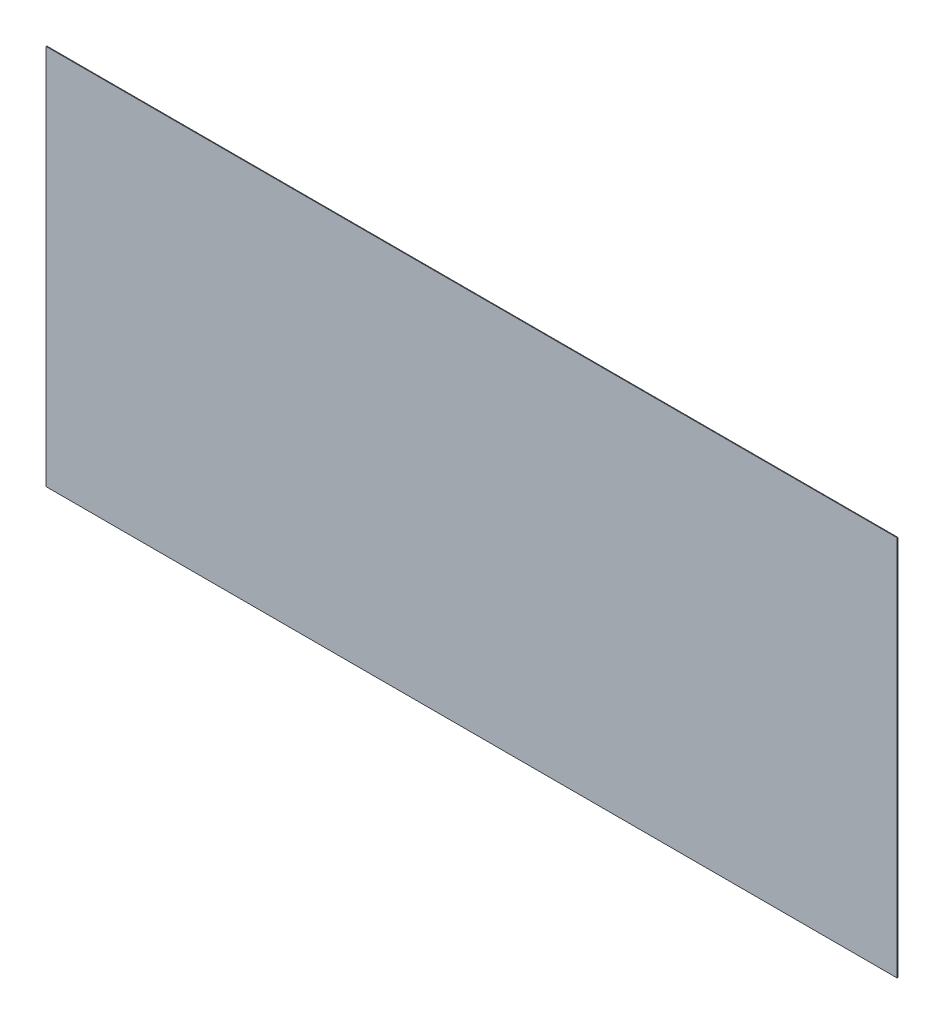
ISO-10303-21;
HEADER;
FILE_DESCRIPTION(('STEP AP214'),'2;1');
FILE_NAME('part.step','',(''),(''),'','','');
FILE_SCHEMA(('AUTOMOTIVE_DESIGN { 1 0 10303 214 1 1 1 1 }'));
ENDSEC;
DATA;
#1=APPLICATION_CONTEXT('core data for automotive mechanical design processes');
#2=APPLICATION_PROTOCOL_DEFINITION('international standard','automotive_design',2000,#1);
#3=PRODUCT_CONTEXT('',#1,'mechanical');
#4=PRODUCT('Part','Part','',(#3));
#5=PRODUCT_RELATED_PRODUCT_CATEGORY('part','',(#4));
#6=PRODUCT_DEFINITION_FORMATION('','',#4);
#7=PRODUCT_DEFINITION_CONTEXT('part definition',#1,'design');
#8=PRODUCT_DEFINITION('design','',#6,#7);
#9=PRODUCT_DEFINITION_SHAPE('','',#8);
#10=(LENGTH_UNIT() NAMED_UNIT(*) SI_UNIT(.MILLI.,.METRE.));
#11=(NAMED_UNIT(*) PLANE_ANGLE_UNIT() SI_UNIT($,.RADIAN.));
#12=(NAMED_UNIT(*) SI_UNIT($,.STERADIAN.) SOLID_ANGLE_UNIT());
#13=UNCERTAINTY_MEASURE_WITH_UNIT(LENGTH_MEASURE(1.E-05),#10,'distance_accuracy_value','');
#14=(GEOMETRIC_REPRESENTATION_CONTEXT(3) GLOBAL_UNCERTAINTY_ASSIGNED_CONTEXT((#13)) GLOBAL_UNIT_ASSIGNED_CONTEXT((#10,
#11,#12)) REPRESENTATION_CONTEXT('',''));
#15=CARTESIAN_POINT('',(0.,0.,0.));
#16=DIRECTION('',(0.,0.,1.));
#17=DIRECTION('',(1.,0.,0.));
#18=AXIS2_PLACEMENT_3D('',#15,#16,#17);
#19=CARTESIAN_POINT('',(-125.,-60.,150.4032));
#20=DIRECTION('',(1.,0.,0.));
#21=DIRECTION('',(0.,1.,0.));
#22=AXIS2_PLACEMENT_3D('',#19,#20,#21);
#23=PLANE('',#22);
#24=DIRECTION('',(0.,0.,1.));
#25=VECTOR('',#24,1.);
#26=CARTESIAN_POINT('',(-125.,19.,140.4032));
#27=LINE('',#26,#25);
#28=CARTESIAN_POINT('',(-125.,19.,150.327));
#29=VERTEX_POINT('',#28);
#30=CARTESIAN_POINT('',(-125.,19.,150.4032));
#31=VERTEX_POINT('',#30);
#32=EDGE_CURVE('E105',#29,#31,#27,.T.);
#33=ORIENTED_EDGE('',*,*,#32,.T.);
#34=DIRECTION('',(0.,-1.,0.));
#35=VECTOR('',#34,1.);
#36=CARTESIAN_POINT('',(-125.,-60.,150.4032));
#37=LINE('',#36,#35);
#38=CARTESIAN_POINT('',(-125.,60.,150.4032));
#39=VERTEX_POINT('',#38);
#40=EDGE_CURVE('E96',#39,#31,#37,.T.);
#41=ORIENTED_EDGE('',*,*,#40,.F.);
#42=DIRECTION('',(0.,0.,-1.));
#43=VECTOR('',#42,1.);
#44=CARTESIAN_POINT('',(-125.,60.,150.4032));
#45=LINE('',#44,#43);
#46=CARTESIAN_POINT('',(-125.,60.,150.327));
#47=VERTEX_POINT('',#46);
#48=EDGE_CURVE('E94',#39,#47,#45,.T.);
#49=ORIENTED_EDGE('',*,*,#48,.T.);
#50=DIRECTION('',(0.,-1.,0.));
#51=VECTOR('',#50,1.);
#52=CARTESIAN_POINT('',(-125.,-60.,150.327));
#53=LINE('',#52,#51);
#54=EDGE_CURVE('E102',#47,#29,#53,.T.);
#55=ORIENTED_EDGE('',*,*,#54,.T.);
#56=EDGE_LOOP('',(#33,#41,#49,#55));
#57=FACE_BOUND('',#56,.T.);
#58=ADVANCED_FACE('F41',(#57),#23,.F.);
#59=CARTESIAN_POINT('',(0.,0.,150.4032));
#60=DIRECTION('',(0.,0.,-1.));
#61=DIRECTION('',(-1.,0.,0.));
#62=AXIS2_PLACEMENT_3D('',#59,#60,#61);
#63=PLANE('',#62);
#64=DIRECTION('',(1.,0.,0.));
#65=VECTOR('',#64,1.);
#66=CARTESIAN_POINT('',(0.,19.,150.4032));
#67=LINE('',#66,#65);
#68=CARTESIAN_POINT('',(-33.5,19.,150.4032));
#69=VERTEX_POINT('',#68);
#70=EDGE_CURVE('E88',#31,#69,#67,.T.);
#71=ORIENTED_EDGE('',*,*,#70,.T.);
#72=DIRECTION('',(0.,-1.,0.));
#73=VECTOR('',#72,1.);
#74=CARTESIAN_POINT('',(-33.5,0.,150.4032));
#75=LINE('',#74,#73);
#76=CARTESIAN_POINT('',(-33.5,60.,150.4032));
#77=VERTEX_POINT('',#76);
#78=EDGE_CURVE('E83',#77,#69,#75,.T.);
#79=ORIENTED_EDGE('',*,*,#78,.F.);
#80=DIRECTION('',(-1.,0.,0.));
#81=VECTOR('',#80,1.);
#82=CARTESIAN_POINT('',(-125.,60.,150.4032));
#83=LINE('',#82,#81);
#84=EDGE_CURVE('E64',#77,#39,#83,.T.);
#85=ORIENTED_EDGE('',*,*,#84,.T.);
#86=ORIENTED_EDGE('',*,*,#40,.T.);
#87=EDGE_LOOP('',(#71,#79,#85,#86));
#88=FACE_BOUND('',#87,.T.);
#89=ADVANCED_FACE('F90',(#88),#63,.F.);
#90=CARTESIAN_POINT('',(0.,0.,150.327));
#91=DIRECTION('',(0.,0.,-1.));
#92=DIRECTION('',(-1.,0.,0.));
#93=AXIS2_PLACEMENT_3D('',#90,#91,#92);
#94=PLANE('',#93);
#95=DIRECTION('',(0.,1.,0.));
#96=VECTOR('',#95,1.);
#97=CARTESIAN_POINT('',(-33.5,0.,150.327));
#98=LINE('',#97,#96);
#99=CARTESIAN_POINT('',(-33.5,19.,150.327));
#100=VERTEX_POINT('',#99);
#101=CARTESIAN_POINT('',(-33.5,60.,150.327));
#102=VERTEX_POINT('',#101);
#103=EDGE_CURVE('E48',#100,#102,#98,.T.);
#104=ORIENTED_EDGE('',*,*,#103,.F.);
#105=DIRECTION('',(-1.,0.,0.));
#106=VECTOR('',#105,1.);
#107=CARTESIAN_POINT('',(0.,19.,150.327));
#108=LINE('',#107,#106);
#109=EDGE_CURVE('E11',#100,#29,#108,.T.);
#110=ORIENTED_EDGE('',*,*,#109,.T.);
#111=ORIENTED_EDGE('',*,*,#54,.F.);
#112=DIRECTION('',(-1.,0.,0.));
#113=VECTOR('',#112,1.);
#114=CARTESIAN_POINT('',(-125.,60.,150.327));
#115=LINE('',#114,#113);
#116=EDGE_CURVE('E99',#102,#47,#115,.T.);
#117=ORIENTED_EDGE('',*,*,#116,.F.);
#118=EDGE_LOOP('',(#104,#110,#111,#117));
#119=FACE_BOUND('',#118,.T.);
#120=ADVANCED_FACE('F110',(#119),#94,.T.);
#121=CARTESIAN_POINT('',(-125.,60.,150.4032));
#122=DIRECTION('',(0.,-1.,0.));
#123=DIRECTION('',(1.,0.,0.));
#124=AXIS2_PLACEMENT_3D('',#121,#122,#123);
#125=PLANE('',#124);
#126=ORIENTED_EDGE('',*,*,#84,.F.);
#127=DIRECTION('',(0.,0.,1.));
#128=VECTOR('',#127,1.);
#129=CARTESIAN_POINT('',(-33.5,60.,140.4032));
#130=LINE('',#129,#128);
#131=EDGE_CURVE('E81',#102,#77,#130,.T.);
#132=ORIENTED_EDGE('',*,*,#131,.F.);
#133=ORIENTED_EDGE('',*,*,#116,.T.);
#134=ORIENTED_EDGE('',*,*,#48,.F.);
#135=EDGE_LOOP('',(#126,#132,#133,#134));
#136=FACE_BOUND('',#135,.T.);
#137=ADVANCED_FACE('F92',(#136),#125,.F.);
#138=CARTESIAN_POINT('',(0.,19.,140.4032));
#139=DIRECTION('',(0.,-1.,0.));
#140=DIRECTION('',(0.,0.,-1.));
#141=AXIS2_PLACEMENT_3D('',#138,#139,#140);
#142=PLANE('',#141);
#143=DIRECTION('',(0.,0.,1.));
#144=VECTOR('',#143,1.);
#145=CARTESIAN_POINT('',(-33.5,19.,140.4032));
#146=LINE('',#145,#144);
#147=EDGE_CURVE('E55',#100,#69,#146,.T.);
#148=ORIENTED_EDGE('',*,*,#147,.T.);
#149=ORIENTED_EDGE('',*,*,#70,.F.);
#150=ORIENTED_EDGE('',*,*,#32,.F.);
#151=ORIENTED_EDGE('',*,*,#109,.F.);
#152=EDGE_LOOP('',(#148,#149,#150,#151));
#153=FACE_BOUND('',#152,.T.);
#154=ADVANCED_FACE('F112',(#153),#142,.T.);
#155=CARTESIAN_POINT('',(-33.5,0.,140.4032));
#156=DIRECTION('',(-1.,0.,0.));
#157=DIRECTION('',(0.,0.,1.));
#158=AXIS2_PLACEMENT_3D('',#155,#156,#157);
#159=PLANE('',#158);
#160=ORIENTED_EDGE('',*,*,#103,.T.);
#161=ORIENTED_EDGE('',*,*,#131,.T.);
#162=ORIENTED_EDGE('',*,*,#78,.T.);
#163=ORIENTED_EDGE('',*,*,#147,.F.);
#164=EDGE_LOOP('',(#160,#161,#162,#163));
#165=FACE_BOUND('',#164,.T.);
#166=ADVANCED_FACE('F82',(#165),#159,.F.);
#167=CLOSED_SHELL('',(#58,#89,#120,#137,#154,#166));
#168=MANIFOLD_SOLID_BREP('B2',#167);
#169=ADVANCED_BREP_SHAPE_REPRESENTATION('',(#18,#168),#14);
#170=SHAPE_DEFINITION_REPRESENTATION(#9,#169);
ENDSEC;
END-ISO-10303-21;
